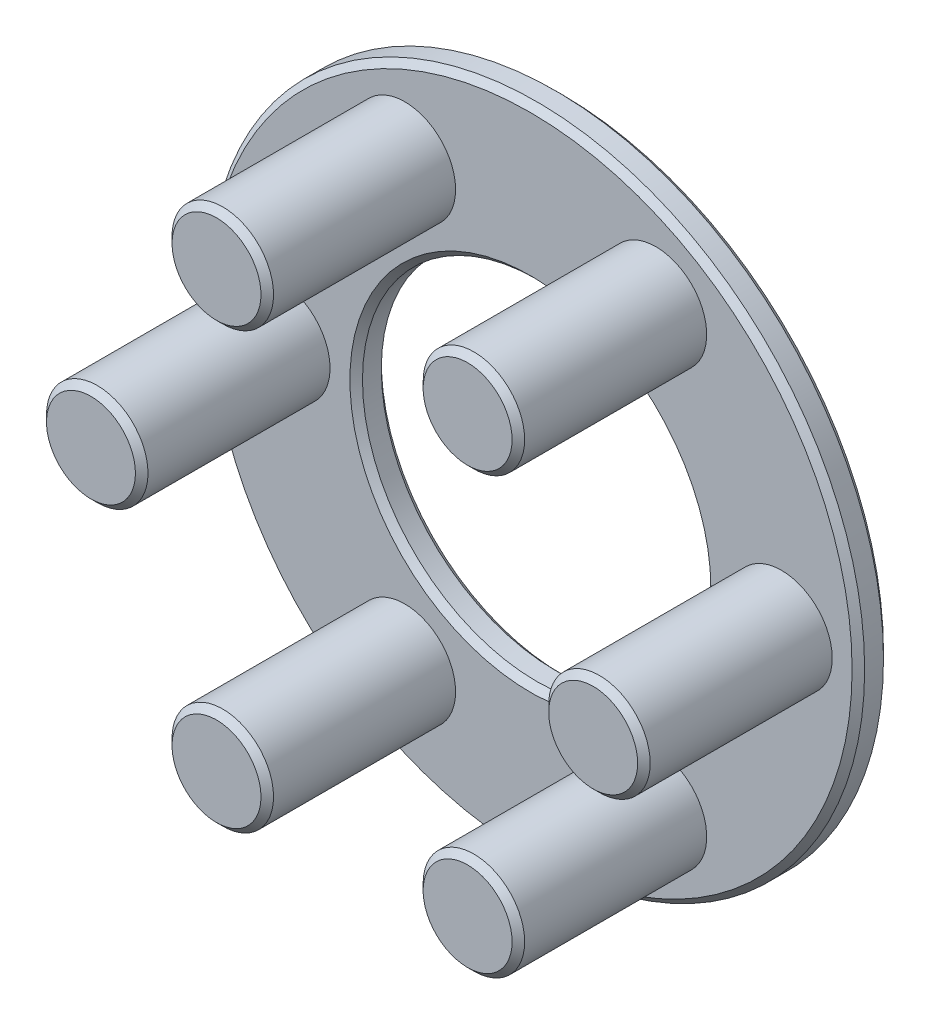
ISO-10303-21;
HEADER;
FILE_DESCRIPTION(('STEP AP214'),'2;1');
FILE_NAME('part.step','',(''),(''),'','','');
FILE_SCHEMA(('AUTOMOTIVE_DESIGN { 1 0 10303 214 1 1 1 1 }'));
ENDSEC;
DATA;
#1=APPLICATION_CONTEXT('core data for automotive mechanical design processes');
#2=APPLICATION_PROTOCOL_DEFINITION('international standard','automotive_design',2000,#1);
#3=PRODUCT_CONTEXT('',#1,'mechanical');
#4=PRODUCT('Part','Part','',(#3));
#5=PRODUCT_RELATED_PRODUCT_CATEGORY('part','',(#4));
#6=PRODUCT_DEFINITION_FORMATION('','',#4);
#7=PRODUCT_DEFINITION_CONTEXT('part definition',#1,'design');
#8=PRODUCT_DEFINITION('design','',#6,#7);
#9=PRODUCT_DEFINITION_SHAPE('','',#8);
#10=(LENGTH_UNIT() NAMED_UNIT(*) SI_UNIT(.MILLI.,.METRE.));
#11=(NAMED_UNIT(*) PLANE_ANGLE_UNIT() SI_UNIT($,.RADIAN.));
#12=(NAMED_UNIT(*) SI_UNIT($,.STERADIAN.) SOLID_ANGLE_UNIT());
#13=UNCERTAINTY_MEASURE_WITH_UNIT(LENGTH_MEASURE(1.E-05),#10,'distance_accuracy_value','');
#14=(GEOMETRIC_REPRESENTATION_CONTEXT(3) GLOBAL_UNCERTAINTY_ASSIGNED_CONTEXT((#13)) GLOBAL_UNIT_ASSIGNED_CONTEXT((#10,
#11,#12)) REPRESENTATION_CONTEXT('',''));
#15=CARTESIAN_POINT('',(0.,0.,0.));
#16=DIRECTION('',(0.,0.,1.));
#17=DIRECTION('',(1.,0.,0.));
#18=AXIS2_PLACEMENT_3D('',#15,#16,#17);
#19=CARTESIAN_POINT('',(0.,0.,1.34454816844028));
#20=DIRECTION('',(0.,0.,1.));
#21=DIRECTION('',(1.,0.,0.));
#22=AXIS2_PLACEMENT_3D('',#19,#20,#21);
#23=CYLINDRICAL_SURFACE('',#22,12.54);
#24=CARTESIAN_POINT('',(0.,0.,1.58454816844028));
#25=DIRECTION('',(0.,0.,1.));
#26=DIRECTION('',(1.,0.,0.));
#27=AXIS2_PLACEMENT_3D('',#24,#25,#26);
#28=CIRCLE('',#27,12.54);
#29=CARTESIAN_POINT('',(12.54,0.,1.58454816844028));
#30=VERTEX_POINT('',#29);
#31=EDGE_CURVE('E78',#30,#30,#28,.T.);
#32=ORIENTED_EDGE('',*,*,#31,.T.);
#33=EDGE_LOOP('',(#32));
#34=FACE_BOUND('',#33,.T.);
#35=CARTESIAN_POINT('',(0.,0.,2.30454816844028));
#36=DIRECTION('',(0.,0.,1.));
#37=DIRECTION('',(1.,0.,0.));
#38=AXIS2_PLACEMENT_3D('',#35,#36,#37);
#39=CIRCLE('',#38,12.54);
#40=CARTESIAN_POINT('',(12.54,0.,2.30454816844028));
#41=VERTEX_POINT('',#40);
#42=EDGE_CURVE('E82',#41,#41,#39,.F.);
#43=ORIENTED_EDGE('',*,*,#42,.T.);
#44=EDGE_LOOP('',(#43));
#45=FACE_BOUND('',#44,.T.);
#46=ADVANCED_FACE('F46',(#34,#45),#23,.T.);
#47=CARTESIAN_POINT('',(0.,0.,1.34454816844028));
#48=DIRECTION('',(0.,0.,1.));
#49=DIRECTION('',(1.,0.,0.));
#50=AXIS2_PLACEMENT_3D('',#47,#48,#49);
#51=PLANE('',#50);
#52=CARTESIAN_POINT('',(0.,0.,1.34454816844028));
#53=DIRECTION('',(0.,0.,1.));
#54=DIRECTION('',(1.,0.,0.));
#55=AXIS2_PLACEMENT_3D('',#52,#53,#54);
#56=CIRCLE('',#55,12.3);
#57=CARTESIAN_POINT('',(12.3,0.,1.34454816844028));
#58=VERTEX_POINT('',#57);
#59=EDGE_CURVE('E70',#58,#58,#56,.F.);
#60=ORIENTED_EDGE('',*,*,#59,.T.);
#61=EDGE_LOOP('',(#60));
#62=FACE_BOUND('',#61,.T.);
#63=CARTESIAN_POINT('',(0.,0.,1.34454816844028));
#64=DIRECTION('',(0.,0.,1.));
#65=DIRECTION('',(1.,0.,0.));
#66=AXIS2_PLACEMENT_3D('',#63,#64,#65);
#67=CIRCLE('',#66,6.9);
#68=CARTESIAN_POINT('',(6.90000000000002,0.,1.34454816844028));
#69=VERTEX_POINT('',#68);
#70=EDGE_CURVE('E74',#69,#69,#67,.T.);
#71=ORIENTED_EDGE('',*,*,#70,.T.);
#72=EDGE_LOOP('',(#71));
#73=FACE_BOUND('',#72,.T.);
#74=ADVANCED_FACE('F165',(#62,#73),#51,.F.);
#75=CARTESIAN_POINT('',(0.,0.,2.54454816844028));
#76=DIRECTION('',(0.,0.,1.));
#77=DIRECTION('',(1.,0.,0.));
#78=AXIS2_PLACEMENT_3D('',#75,#76,#77);
#79=PLANE('',#78);
#80=CARTESIAN_POINT('',(0.,0.,2.54454816844028));
#81=DIRECTION('',(0.,0.,1.));
#82=DIRECTION('',(1.,0.,0.));
#83=AXIS2_PLACEMENT_3D('',#80,#81,#82);
#84=CIRCLE('',#83,12.3);
#85=CARTESIAN_POINT('',(12.3,0.,2.54454816844028));
#86=VERTEX_POINT('',#85);
#87=EDGE_CURVE('E59',#86,#86,#84,.T.);
#88=ORIENTED_EDGE('',*,*,#87,.T.);
#89=EDGE_LOOP('',(#88));
#90=FACE_BOUND('',#89,.T.);
#91=CARTESIAN_POINT('',(0.,0.,2.54454816844028));
#92=DIRECTION('',(0.,0.,1.));
#93=DIRECTION('',(1.,0.,0.));
#94=AXIS2_PLACEMENT_3D('',#91,#92,#93);
#95=CIRCLE('',#94,6.9);
#96=CARTESIAN_POINT('',(6.90000000000001,0.,2.54454816844028));
#97=VERTEX_POINT('',#96);
#98=EDGE_CURVE('E64',#97,#97,#95,.F.);
#99=ORIENTED_EDGE('',*,*,#98,.T.);
#100=EDGE_LOOP('',(#99));
#101=FACE_BOUND('',#100,.T.);
#102=CARTESIAN_POINT('',(4.80000000000011,8.31384387633056,2.54454816844028));
#103=DIRECTION('',(0.,0.,1.));
#104=DIRECTION('',(0.50000000000001,0.866025403784433,0.));
#105=AXIS2_PLACEMENT_3D('',#102,#103,#104);
#106=CIRCLE('',#105,1.94);
#107=CARTESIAN_POINT('',(5.77000000000013,9.99393315967236,2.54454816844028));
#108=VERTEX_POINT('',#107);
#109=EDGE_CURVE('E154',#108,#108,#106,.T.);
#110=ORIENTED_EDGE('',*,*,#109,.F.);
#111=EDGE_LOOP('',(#110));
#112=FACE_BOUND('',#111,.T.);
#113=CARTESIAN_POINT('',(-4.79999999999991,8.31384387633065,2.54454816844028));
#114=DIRECTION('',(0.,0.,1.));
#115=DIRECTION('',(-0.499999999999992,0.866025403784443,0.));
#116=AXIS2_PLACEMENT_3D('',#113,#114,#115);
#117=CIRCLE('',#116,1.94);
#118=CARTESIAN_POINT('',(-5.76999999999989,9.99393315967247,2.54454816844028));
#119=VERTEX_POINT('',#118);
#120=EDGE_CURVE('E150',#119,#119,#117,.T.);
#121=ORIENTED_EDGE('',*,*,#120,.F.);
#122=EDGE_LOOP('',(#121));
#123=FACE_BOUND('',#122,.T.);
#124=CARTESIAN_POINT('',(-9.59999999999998,0.,2.54454816844028));
#125=DIRECTION('',(0.,0.,1.));
#126=DIRECTION('',(-1.,0.,0.));
#127=AXIS2_PLACEMENT_3D('',#124,#125,#126);
#128=CIRCLE('',#127,1.94);
#129=CARTESIAN_POINT('',(-11.54,0.,2.54454816844028));
#130=VERTEX_POINT('',#129);
#131=EDGE_CURVE('E146',#130,#130,#128,.T.);
#132=ORIENTED_EDGE('',*,*,#131,.F.);
#133=EDGE_LOOP('',(#132));
#134=FACE_BOUND('',#133,.T.);
#135=CARTESIAN_POINT('',(-4.80000000000002,-8.31384387633059,2.54454816844028));
#136=DIRECTION('',(0.,0.,1.));
#137=DIRECTION('',(-0.500000000000004,-0.866025403784436,0.));
#138=AXIS2_PLACEMENT_3D('',#135,#136,#137);
#139=CIRCLE('',#138,1.94);
#140=CARTESIAN_POINT('',(-5.77000000000003,-9.9939331596724,2.54454816844028));
#141=VERTEX_POINT('',#140);
#142=EDGE_CURVE('E142',#141,#141,#139,.T.);
#143=ORIENTED_EDGE('',*,*,#142,.F.);
#144=EDGE_LOOP('',(#143));
#145=FACE_BOUND('',#144,.T.);
#146=CARTESIAN_POINT('',(4.8,-8.31384387633062,2.54454816844028));
#147=DIRECTION('',(0.,0.,1.));
#148=DIRECTION('',(0.499999999999998,-0.86602540378444,0.));
#149=AXIS2_PLACEMENT_3D('',#146,#147,#148);
#150=CIRCLE('',#149,1.94);
#151=CARTESIAN_POINT('',(5.76999999999999,-9.99393315967244,2.54454816844028));
#152=VERTEX_POINT('',#151);
#153=EDGE_CURVE('E138',#152,#152,#150,.T.);
#154=ORIENTED_EDGE('',*,*,#153,.F.);
#155=EDGE_LOOP('',(#154));
#156=FACE_BOUND('',#155,.T.);
#157=CARTESIAN_POINT('',(9.60000000000002,0.,2.54454816844028));
#158=DIRECTION('',(0.,0.,1.));
#159=DIRECTION('',(1.,0.,0.));
#160=AXIS2_PLACEMENT_3D('',#157,#158,#159);
#161=CIRCLE('',#160,1.94);
#162=CARTESIAN_POINT('',(11.54,0.,2.54454816844028));
#163=VERTEX_POINT('',#162);
#164=EDGE_CURVE('E134',#163,#163,#161,.T.);
#165=ORIENTED_EDGE('',*,*,#164,.F.);
#166=EDGE_LOOP('',(#165));
#167=FACE_BOUND('',#166,.T.);
#168=ADVANCED_FACE('F161',(#90,#101,#112,#123,#134,#145,#156,#167),#79,.T.);
#169=CARTESIAN_POINT('',(0.,0.,1.34454816844028));
#170=DIRECTION('',(0.,0.,1.));
#171=DIRECTION('',(1.,0.,0.));
#172=AXIS2_PLACEMENT_3D('',#169,#170,#171);
#173=CYLINDRICAL_SURFACE('',#172,6.66);
#174=CARTESIAN_POINT('',(0.,0.,1.58454816844028));
#175=DIRECTION('',(0.,0.,1.));
#176=DIRECTION('',(1.,0.,0.));
#177=AXIS2_PLACEMENT_3D('',#174,#175,#176);
#178=CIRCLE('',#177,6.66);
#179=CARTESIAN_POINT('',(6.66000000000002,0.,1.58454816844028));
#180=VERTEX_POINT('',#179);
#181=EDGE_CURVE('E10',#180,#180,#178,.F.);
#182=ORIENTED_EDGE('',*,*,#181,.T.);
#183=EDGE_LOOP('',(#182));
#184=FACE_BOUND('',#183,.T.);
#185=CARTESIAN_POINT('',(0.,0.,2.30454816844028));
#186=DIRECTION('',(0.,0.,1.));
#187=DIRECTION('',(1.,0.,0.));
#188=AXIS2_PLACEMENT_3D('',#185,#186,#187);
#189=CIRCLE('',#188,6.66);
#190=CARTESIAN_POINT('',(6.66000000000002,0.,2.30454816844028));
#191=VERTEX_POINT('',#190);
#192=EDGE_CURVE('E54',#191,#191,#189,.T.);
#193=ORIENTED_EDGE('',*,*,#192,.T.);
#194=EDGE_LOOP('',(#193));
#195=FACE_BOUND('',#194,.T.);
#196=ADVANCED_FACE('F164',(#184,#195),#173,.F.);
#197=CARTESIAN_POINT('',(9.60000000000002,0.,9.74454816844028));
#198=DIRECTION('',(0.,0.,-1.));
#199=DIRECTION('',(-1.,0.,0.));
#200=AXIS2_PLACEMENT_3D('',#197,#198,#199);
#201=CYLINDRICAL_SURFACE('',#200,1.94);
#202=CARTESIAN_POINT('',(9.60000000000002,0.,9.50454816844028));
#203=DIRECTION('',(0.,0.,1.));
#204=DIRECTION('',(1.,0.,0.));
#205=AXIS2_PLACEMENT_3D('',#202,#203,#204);
#206=CIRCLE('',#205,1.94);
#207=CARTESIAN_POINT('',(11.54,0.,9.50454816844028));
#208=VERTEX_POINT('',#207);
#209=EDGE_CURVE('E110',#208,#208,#206,.F.);
#210=ORIENTED_EDGE('',*,*,#209,.T.);
#211=EDGE_LOOP('',(#210));
#212=FACE_BOUND('',#211,.T.);
#213=ORIENTED_EDGE('',*,*,#164,.T.);
#214=EDGE_LOOP('',(#213));
#215=FACE_BOUND('',#214,.T.);
#216=ADVANCED_FACE('F178',(#212,#215),#201,.T.);
#217=CARTESIAN_POINT('',(9.60000000000002,0.,9.74454816844028));
#218=DIRECTION('',(0.,0.,1.));
#219=DIRECTION('',(1.,0.,0.));
#220=AXIS2_PLACEMENT_3D('',#217,#218,#219);
#221=PLANE('',#220);
#222=CARTESIAN_POINT('',(9.60000000000002,0.,9.74454816844028));
#223=DIRECTION('',(0.,0.,1.));
#224=DIRECTION('',(1.,0.,0.));
#225=AXIS2_PLACEMENT_3D('',#222,#223,#224);
#226=CIRCLE('',#225,1.7);
#227=CARTESIAN_POINT('',(11.3,0.,9.74454816844028));
#228=VERTEX_POINT('',#227);
#229=EDGE_CURVE('E114',#228,#228,#226,.T.);
#230=ORIENTED_EDGE('',*,*,#229,.T.);
#231=EDGE_LOOP('',(#230));
#232=FACE_BOUND('',#231,.T.);
#233=ADVANCED_FACE('F180',(#232),#221,.T.);
#234=CARTESIAN_POINT('',(4.8,-8.31384387633062,9.74454816844028));
#235=DIRECTION('',(0.,0.,-1.));
#236=DIRECTION('',(-1.,0.,0.));
#237=AXIS2_PLACEMENT_3D('',#234,#235,#236);
#238=CYLINDRICAL_SURFACE('',#237,1.94);
#239=CARTESIAN_POINT('',(4.8,-8.31384387633062,9.50454816844028));
#240=DIRECTION('',(0.,0.,1.));
#241=DIRECTION('',(1.,0.,0.));
#242=AXIS2_PLACEMENT_3D('',#239,#240,#241);
#243=CIRCLE('',#242,1.94);
#244=CARTESIAN_POINT('',(6.74,-8.31384387633062,9.50454816844028));
#245=VERTEX_POINT('',#244);
#246=EDGE_CURVE('E118',#245,#245,#243,.F.);
#247=ORIENTED_EDGE('',*,*,#246,.T.);
#248=EDGE_LOOP('',(#247));
#249=FACE_BOUND('',#248,.T.);
#250=ORIENTED_EDGE('',*,*,#153,.T.);
#251=EDGE_LOOP('',(#250));
#252=FACE_BOUND('',#251,.T.);
#253=ADVANCED_FACE('F187',(#249,#252),#238,.T.);
#254=CARTESIAN_POINT('',(4.8,-8.31384387633062,9.74454816844028));
#255=DIRECTION('',(0.,0.,1.));
#256=DIRECTION('',(0.499999999999998,-0.86602540378444,0.));
#257=AXIS2_PLACEMENT_3D('',#254,#255,#256);
#258=PLANE('',#257);
#259=CARTESIAN_POINT('',(4.8,-8.31384387633062,9.74454816844028));
#260=DIRECTION('',(0.,0.,1.));
#261=DIRECTION('',(1.,0.,0.));
#262=AXIS2_PLACEMENT_3D('',#259,#260,#261);
#263=CIRCLE('',#262,1.7);
#264=CARTESIAN_POINT('',(6.5,-8.31384387633062,9.74454816844028));
#265=VERTEX_POINT('',#264);
#266=EDGE_CURVE('E122',#265,#265,#263,.T.);
#267=ORIENTED_EDGE('',*,*,#266,.T.);
#268=EDGE_LOOP('',(#267));
#269=FACE_BOUND('',#268,.T.);
#270=ADVANCED_FACE('F379',(#269),#258,.T.);
#271=CARTESIAN_POINT('',(-4.80000000000002,-8.31384387633059,9.74454816844028));
#272=DIRECTION('',(0.,0.,-1.));
#273=DIRECTION('',(-1.,0.,0.));
#274=AXIS2_PLACEMENT_3D('',#271,#272,#273);
#275=CYLINDRICAL_SURFACE('',#274,1.94);
#276=CARTESIAN_POINT('',(-4.80000000000002,-8.31384387633059,9.50454816844028));
#277=DIRECTION('',(0.,0.,1.));
#278=DIRECTION('',(1.,0.,0.));
#279=AXIS2_PLACEMENT_3D('',#276,#277,#278);
#280=CIRCLE('',#279,1.94);
#281=CARTESIAN_POINT('',(-2.86000000000002,-8.31384387633059,9.50454816844028));
#282=VERTEX_POINT('',#281);
#283=EDGE_CURVE('E126',#282,#282,#280,.F.);
#284=ORIENTED_EDGE('',*,*,#283,.T.);
#285=EDGE_LOOP('',(#284));
#286=FACE_BOUND('',#285,.T.);
#287=ORIENTED_EDGE('',*,*,#142,.T.);
#288=EDGE_LOOP('',(#287));
#289=FACE_BOUND('',#288,.T.);
#290=ADVANCED_FACE('F369',(#286,#289),#275,.T.);
#291=CARTESIAN_POINT('',(-4.80000000000002,-8.31384387633059,9.74454816844028));
#292=DIRECTION('',(0.,0.,1.));
#293=DIRECTION('',(-0.500000000000004,-0.866025403784436,0.));
#294=AXIS2_PLACEMENT_3D('',#291,#292,#293);
#295=PLANE('',#294);
#296=CARTESIAN_POINT('',(-4.80000000000002,-8.31384387633059,9.74454816844028));
#297=DIRECTION('',(0.,0.,1.));
#298=DIRECTION('',(1.,0.,0.));
#299=AXIS2_PLACEMENT_3D('',#296,#297,#298);
#300=CIRCLE('',#299,1.70000000000001);
#301=CARTESIAN_POINT('',(-3.10000000000002,-8.31384387633059,9.74454816844028));
#302=VERTEX_POINT('',#301);
#303=EDGE_CURVE('E130',#302,#302,#300,.T.);
#304=ORIENTED_EDGE('',*,*,#303,.T.);
#305=EDGE_LOOP('',(#304));
#306=FACE_BOUND('',#305,.T.);
#307=ADVANCED_FACE('F359',(#306),#295,.T.);
#308=CARTESIAN_POINT('',(-9.59999999999998,0.,9.74454816844028));
#309=DIRECTION('',(0.,0.,-1.));
#310=DIRECTION('',(-1.,0.,0.));
#311=AXIS2_PLACEMENT_3D('',#308,#309,#310);
#312=CYLINDRICAL_SURFACE('',#311,1.94);
#313=CARTESIAN_POINT('',(-9.59999999999998,0.,9.50454816844028));
#314=DIRECTION('',(0.,0.,1.));
#315=DIRECTION('',(1.,0.,0.));
#316=AXIS2_PLACEMENT_3D('',#313,#314,#315);
#317=CIRCLE('',#316,1.94);
#318=CARTESIAN_POINT('',(-7.65999999999998,0.,9.50454816844028));
#319=VERTEX_POINT('',#318);
#320=EDGE_CURVE('E94',#319,#319,#317,.F.);
#321=ORIENTED_EDGE('',*,*,#320,.T.);
#322=EDGE_LOOP('',(#321));
#323=FACE_BOUND('',#322,.T.);
#324=ORIENTED_EDGE('',*,*,#131,.T.);
#325=EDGE_LOOP('',(#324));
#326=FACE_BOUND('',#325,.T.);
#327=ADVANCED_FACE('F349',(#323,#326),#312,.T.);
#328=CARTESIAN_POINT('',(-9.59999999999998,0.,9.74454816844028));
#329=DIRECTION('',(0.,0.,1.));
#330=DIRECTION('',(-1.,0.,0.));
#331=AXIS2_PLACEMENT_3D('',#328,#329,#330);
#332=PLANE('',#331);
#333=CARTESIAN_POINT('',(-9.59999999999998,0.,9.74454816844028));
#334=DIRECTION('',(0.,0.,1.));
#335=DIRECTION('',(1.,0.,0.));
#336=AXIS2_PLACEMENT_3D('',#333,#334,#335);
#337=CIRCLE('',#336,1.7);
#338=CARTESIAN_POINT('',(-7.89999999999998,0.,9.74454816844028));
#339=VERTEX_POINT('',#338);
#340=EDGE_CURVE('E98',#339,#339,#337,.T.);
#341=ORIENTED_EDGE('',*,*,#340,.T.);
#342=EDGE_LOOP('',(#341));
#343=FACE_BOUND('',#342,.T.);
#344=ADVANCED_FACE('F339',(#343),#332,.T.);
#345=CARTESIAN_POINT('',(-4.79999999999991,8.31384387633065,9.74454816844028));
#346=DIRECTION('',(0.,0.,-1.));
#347=DIRECTION('',(-1.,0.,0.));
#348=AXIS2_PLACEMENT_3D('',#345,#346,#347);
#349=CYLINDRICAL_SURFACE('',#348,1.94);
#350=CARTESIAN_POINT('',(-4.79999999999991,8.31384387633065,9.50454816844028));
#351=DIRECTION('',(0.,0.,1.));
#352=DIRECTION('',(1.,0.,0.));
#353=AXIS2_PLACEMENT_3D('',#350,#351,#352);
#354=CIRCLE('',#353,1.94);
#355=CARTESIAN_POINT('',(-2.85999999999991,8.31384387633065,9.50454816844028));
#356=VERTEX_POINT('',#355);
#357=EDGE_CURVE('E86',#356,#356,#354,.F.);
#358=ORIENTED_EDGE('',*,*,#357,.T.);
#359=EDGE_LOOP('',(#358));
#360=FACE_BOUND('',#359,.T.);
#361=ORIENTED_EDGE('',*,*,#120,.T.);
#362=EDGE_LOOP('',(#361));
#363=FACE_BOUND('',#362,.T.);
#364=ADVANCED_FACE('F329',(#360,#363),#349,.T.);
#365=CARTESIAN_POINT('',(-4.79999999999991,8.31384387633065,9.74454816844028));
#366=DIRECTION('',(0.,0.,1.));
#367=DIRECTION('',(-0.499999999999992,0.866025403784443,0.));
#368=AXIS2_PLACEMENT_3D('',#365,#366,#367);
#369=PLANE('',#368);
#370=CARTESIAN_POINT('',(-4.79999999999991,8.31384387633065,9.74454816844028));
#371=DIRECTION('',(0.,0.,1.));
#372=DIRECTION('',(1.,0.,0.));
#373=AXIS2_PLACEMENT_3D('',#370,#371,#372);
#374=CIRCLE('',#373,1.70000000000001);
#375=CARTESIAN_POINT('',(-3.0999999999999,8.31384387633065,9.74454816844028));
#376=VERTEX_POINT('',#375);
#377=EDGE_CURVE('E90',#376,#376,#374,.T.);
#378=ORIENTED_EDGE('',*,*,#377,.T.);
#379=EDGE_LOOP('',(#378));
#380=FACE_BOUND('',#379,.T.);
#381=ADVANCED_FACE('F319',(#380),#369,.T.);
#382=CARTESIAN_POINT('',(4.80000000000011,8.31384387633056,9.74454816844028));
#383=DIRECTION('',(0.,0.,-1.));
#384=DIRECTION('',(-1.,0.,0.));
#385=AXIS2_PLACEMENT_3D('',#382,#383,#384);
#386=CYLINDRICAL_SURFACE('',#385,1.94);
#387=CARTESIAN_POINT('',(4.80000000000011,8.31384387633056,9.50454816844027));
#388=DIRECTION('',(0.,0.,1.));
#389=DIRECTION('',(1.,0.,0.));
#390=AXIS2_PLACEMENT_3D('',#387,#388,#389);
#391=CIRCLE('',#390,1.94);
#392=CARTESIAN_POINT('',(6.74000000000011,8.31384387633056,9.50454816844027));
#393=VERTEX_POINT('',#392);
#394=EDGE_CURVE('E102',#393,#393,#391,.F.);
#395=ORIENTED_EDGE('',*,*,#394,.T.);
#396=EDGE_LOOP('',(#395));
#397=FACE_BOUND('',#396,.T.);
#398=ORIENTED_EDGE('',*,*,#109,.T.);
#399=EDGE_LOOP('',(#398));
#400=FACE_BOUND('',#399,.T.);
#401=ADVANCED_FACE('F159',(#397,#400),#386,.T.);
#402=CARTESIAN_POINT('',(4.80000000000011,8.31384387633056,9.74454816844028));
#403=DIRECTION('',(0.,0.,1.));
#404=DIRECTION('',(0.50000000000001,0.866025403784433,0.));
#405=AXIS2_PLACEMENT_3D('',#402,#403,#404);
#406=PLANE('',#405);
#407=CARTESIAN_POINT('',(4.80000000000011,8.31384387633056,9.74454816844028));
#408=DIRECTION('',(0.,0.,1.));
#409=DIRECTION('',(1.,0.,0.));
#410=AXIS2_PLACEMENT_3D('',#407,#408,#409);
#411=CIRCLE('',#410,1.7);
#412=CARTESIAN_POINT('',(6.50000000000011,8.31384387633056,9.74454816844028));
#413=VERTEX_POINT('',#412);
#414=EDGE_CURVE('E106',#413,#413,#411,.T.);
#415=ORIENTED_EDGE('',*,*,#414,.T.);
#416=EDGE_LOOP('',(#415));
#417=FACE_BOUND('',#416,.T.);
#418=ADVANCED_FACE('F205',(#417),#406,.T.);
#419=CARTESIAN_POINT('',(-4.80000000000002,-8.31384387633059,9.74454816844028));
#420=DIRECTION('',(0.,0.,-1.));
#421=DIRECTION('',(-1.,0.,0.));
#422=AXIS2_PLACEMENT_3D('',#419,#420,#421);
#423=CONICAL_SURFACE('',#422,1.70000000000001,0.785398163397436);
#424=ORIENTED_EDGE('',*,*,#283,.F.);
#425=EDGE_LOOP('',(#424));
#426=FACE_BOUND('',#425,.T.);
#427=ORIENTED_EDGE('',*,*,#303,.F.);
#428=EDGE_LOOP('',(#427));
#429=FACE_BOUND('',#428,.T.);
#430=ADVANCED_FACE('F201',(#426,#429),#423,.T.);
#431=CARTESIAN_POINT('',(4.8,-8.31384387633062,9.74454816844028));
#432=DIRECTION('',(0.,0.,-1.));
#433=DIRECTION('',(-1.,0.,0.));
#434=AXIS2_PLACEMENT_3D('',#431,#432,#433);
#435=CONICAL_SURFACE('',#434,1.7,0.78539816339745);
#436=ORIENTED_EDGE('',*,*,#246,.F.);
#437=EDGE_LOOP('',(#436));
#438=FACE_BOUND('',#437,.T.);
#439=ORIENTED_EDGE('',*,*,#266,.F.);
#440=EDGE_LOOP('',(#439));
#441=FACE_BOUND('',#440,.T.);
#442=ADVANCED_FACE('F204',(#438,#441),#435,.T.);
#443=CARTESIAN_POINT('',(9.60000000000002,0.,9.74454816844028));
#444=DIRECTION('',(0.,0.,-1.));
#445=DIRECTION('',(-1.,0.,0.));
#446=AXIS2_PLACEMENT_3D('',#443,#444,#445);
#447=CONICAL_SURFACE('',#446,1.7,0.78539816339745);
#448=ORIENTED_EDGE('',*,*,#209,.F.);
#449=EDGE_LOOP('',(#448));
#450=FACE_BOUND('',#449,.T.);
#451=ORIENTED_EDGE('',*,*,#229,.F.);
#452=EDGE_LOOP('',(#451));
#453=FACE_BOUND('',#452,.T.);
#454=ADVANCED_FACE('F209',(#450,#453),#447,.T.);
#455=CARTESIAN_POINT('',(4.80000000000011,8.31384387633056,9.74454816844028));
#456=DIRECTION('',(0.,0.,-1.));
#457=DIRECTION('',(-1.,0.,0.));
#458=AXIS2_PLACEMENT_3D('',#455,#456,#457);
#459=CONICAL_SURFACE('',#458,1.7,0.785398163397448);
#460=ORIENTED_EDGE('',*,*,#394,.F.);
#461=EDGE_LOOP('',(#460));
#462=FACE_BOUND('',#461,.T.);
#463=ORIENTED_EDGE('',*,*,#414,.F.);
#464=EDGE_LOOP('',(#463));
#465=FACE_BOUND('',#464,.T.);
#466=ADVANCED_FACE('F213',(#462,#465),#459,.T.);
#467=CARTESIAN_POINT('',(-9.59999999999998,0.,9.74454816844028));
#468=DIRECTION('',(0.,0.,-1.));
#469=DIRECTION('',(-1.,0.,0.));
#470=AXIS2_PLACEMENT_3D('',#467,#468,#469);
#471=CONICAL_SURFACE('',#470,1.7,0.78539816339745);
#472=ORIENTED_EDGE('',*,*,#320,.F.);
#473=EDGE_LOOP('',(#472));
#474=FACE_BOUND('',#473,.T.);
#475=ORIENTED_EDGE('',*,*,#340,.F.);
#476=EDGE_LOOP('',(#475));
#477=FACE_BOUND('',#476,.T.);
#478=ADVANCED_FACE('F217',(#474,#477),#471,.T.);
#479=CARTESIAN_POINT('',(-4.79999999999991,8.31384387633065,9.74454816844028));
#480=DIRECTION('',(0.,0.,-1.));
#481=DIRECTION('',(-1.,0.,0.));
#482=AXIS2_PLACEMENT_3D('',#479,#480,#481);
#483=CONICAL_SURFACE('',#482,1.70000000000001,0.785398163397438);
#484=ORIENTED_EDGE('',*,*,#357,.F.);
#485=EDGE_LOOP('',(#484));
#486=FACE_BOUND('',#485,.T.);
#487=ORIENTED_EDGE('',*,*,#377,.F.);
#488=EDGE_LOOP('',(#487));
#489=FACE_BOUND('',#488,.T.);
#490=ADVANCED_FACE('F221',(#486,#489),#483,.T.);
#491=CARTESIAN_POINT('',(0.,0.,1.58454816844028));
#492=DIRECTION('',(0.,0.,1.));
#493=DIRECTION('',(1.,0.,0.));
#494=AXIS2_PLACEMENT_3D('',#491,#492,#493);
#495=CONICAL_SURFACE('',#494,12.54,0.785398163397454);
#496=CARTESIAN_POINT('',(12.3,0.,1.34454816844028));
#497=CARTESIAN_POINT('',(12.3025,0.,1.34704816844028));
#498=CARTESIAN_POINT('',(12.305,0.,1.34954816844028));
#499=CARTESIAN_POINT('',(12.31,0.,1.35454816844028));
#500=CARTESIAN_POINT('',(12.3125,0.,1.35704816844028));
#501=CARTESIAN_POINT('',(12.3175,0.,1.36204816844028));
#502=CARTESIAN_POINT('',(12.32,0.,1.36454816844028));
#503=CARTESIAN_POINT('',(12.325,0.,1.36954816844028));
#504=CARTESIAN_POINT('',(12.3275,0.,1.37204816844028));
#505=CARTESIAN_POINT('',(12.3325,0.,1.37704816844028));
#506=CARTESIAN_POINT('',(12.335,0.,1.37954816844028));
#507=CARTESIAN_POINT('',(12.34,0.,1.38454816844028));
#508=CARTESIAN_POINT('',(12.3425,0.,1.38704816844028));
#509=CARTESIAN_POINT('',(12.3475,0.,1.39204816844028));
#510=CARTESIAN_POINT('',(12.35,0.,1.39454816844028));
#511=CARTESIAN_POINT('',(12.355,0.,1.39954816844028));
#512=CARTESIAN_POINT('',(12.3575,0.,1.40204816844028));
#513=CARTESIAN_POINT('',(12.3625,0.,1.40704816844028));
#514=CARTESIAN_POINT('',(12.365,0.,1.40954816844028));
#515=CARTESIAN_POINT('',(12.37,0.,1.41454816844028));
#516=CARTESIAN_POINT('',(12.3725,0.,1.41704816844028));
#517=CARTESIAN_POINT('',(12.3775,0.,1.42204816844028));
#518=CARTESIAN_POINT('',(12.38,0.,1.42454816844028));
#519=CARTESIAN_POINT('',(12.385,0.,1.42954816844028));
#520=CARTESIAN_POINT('',(12.3875,0.,1.43204816844028));
#521=CARTESIAN_POINT('',(12.3925,0.,1.43704816844028));
#522=CARTESIAN_POINT('',(12.395,0.,1.43954816844028));
#523=CARTESIAN_POINT('',(12.4,0.,1.44454816844028));
#524=CARTESIAN_POINT('',(12.4025,0.,1.44704816844028));
#525=CARTESIAN_POINT('',(12.4075,0.,1.45204816844028));
#526=CARTESIAN_POINT('',(12.41,0.,1.45454816844028));
#527=CARTESIAN_POINT('',(12.415,0.,1.45954816844028));
#528=CARTESIAN_POINT('',(12.4175,0.,1.46204816844028));
#529=CARTESIAN_POINT('',(12.4225,0.,1.46704816844028));
#530=CARTESIAN_POINT('',(12.425,0.,1.46954816844028));
#531=CARTESIAN_POINT('',(12.43,0.,1.47454816844028));
#532=CARTESIAN_POINT('',(12.4325,0.,1.47704816844028));
#533=CARTESIAN_POINT('',(12.4375,0.,1.48204816844028));
#534=CARTESIAN_POINT('',(12.44,0.,1.48454816844028));
#535=CARTESIAN_POINT('',(12.445,0.,1.48954816844028));
#536=CARTESIAN_POINT('',(12.4475,0.,1.49204816844028));
#537=CARTESIAN_POINT('',(12.4525,0.,1.49704816844028));
#538=CARTESIAN_POINT('',(12.455,0.,1.49954816844028));
#539=CARTESIAN_POINT('',(12.46,0.,1.50454816844028));
#540=CARTESIAN_POINT('',(12.4625,0.,1.50704816844028));
#541=CARTESIAN_POINT('',(12.4675,0.,1.51204816844028));
#542=CARTESIAN_POINT('',(12.47,0.,1.51454816844028));
#543=CARTESIAN_POINT('',(12.475,0.,1.51954816844028));
#544=CARTESIAN_POINT('',(12.4775,0.,1.52204816844028));
#545=CARTESIAN_POINT('',(12.4825,0.,1.52704816844028));
#546=CARTESIAN_POINT('',(12.485,0.,1.52954816844028));
#547=CARTESIAN_POINT('',(12.49,0.,1.53454816844028));
#548=CARTESIAN_POINT('',(12.4925,0.,1.53704816844028));
#549=CARTESIAN_POINT('',(12.4975,0.,1.54204816844028));
#550=CARTESIAN_POINT('',(12.5,0.,1.54454816844028));
#551=CARTESIAN_POINT('',(12.505,0.,1.54954816844028));
#552=CARTESIAN_POINT('',(12.5075,0.,1.55204816844028));
#553=CARTESIAN_POINT('',(12.5125,0.,1.55704816844028));
#554=CARTESIAN_POINT('',(12.515,0.,1.55954816844028));
#555=CARTESIAN_POINT('',(12.52,0.,1.56454816844028));
#556=CARTESIAN_POINT('',(12.5225,0.,1.56704816844028));
#557=CARTESIAN_POINT('',(12.5275,0.,1.57204816844028));
#558=CARTESIAN_POINT('',(12.53,0.,1.57454816844028));
#559=CARTESIAN_POINT('',(12.535,0.,1.57954816844028));
#560=CARTESIAN_POINT('',(12.5375,0.,1.58204816844028));
#561=CARTESIAN_POINT('',(12.54,0.,1.58454816844028));
#562=B_SPLINE_CURVE_WITH_KNOTS('',3,(#496,#497,#498,#499,#500,#501,#502,#503,#504,#505,#506,
#507,#508,#509,#510,#511,#512,#513,#514,#515,#516,#517,#518,#519,#520,#521,#522,#523,#524,#525,
#526,#527,#528,#529,#530,#531,#532,#533,#534,#535,#536,#537,#538,#539,#540,#541,#542,#543,#544,
#545,#546,#547,#548,#549,#550,#551,#552,#553,#554,#555,#556,#557,#558,#559,#560,#561),
.UNSPECIFIED.,.F.,.F.,(4,2,2,2,2,2,2,2,2,2,2,2,2,2,2,2,2,2,2,2,2,2,2,2,2,2,2,2,2,2,2,2,4),(0.,
0.0106066017177987,0.0212132034355974,0.0318198051533961,0.0424264068711948,0.0530330085889923,
0.063639610306791,0.0742462120245897,0.0848528137423884,0.0954594154601871,0.106066017177985,
0.116672618895783,0.127279220613582,0.137885822331381,0.14849242404918,0.159099025766977,
0.169705627484776,0.180312229202574,0.190918830920373,0.201525432638172,0.212132034355969,
0.222738636073768,0.233345237791566,0.243951839509365,0.254558441227164,0.265165042944961,
0.27577164466276,0.286378246380559,0.296984848098358,0.307591449816156,0.318198051533954,
0.328804653251752,0.339411254969551),.UNSPECIFIED.);
#563=EDGE_CURVE('BSEAM225',#58,#30,#562,.T.);
#564=ORIENTED_EDGE('',*,*,#59,.F.);
#565=ORIENTED_EDGE('',*,*,#31,.F.);
#566=ORIENTED_EDGE('',*,*,#563,.T.);
#567=ORIENTED_EDGE('',*,*,#563,.F.);
#568=EDGE_LOOP('',(#564,#566,#565,#567));
#569=FACE_BOUND('',#568,.T.);
#570=ADVANCED_FACE('F225',(#569),#495,.T.);
#571=CARTESIAN_POINT('',(0.,0.,2.54454816844028));
#572=DIRECTION('',(0.,0.,-1.));
#573=DIRECTION('',(-1.,0.,0.));
#574=AXIS2_PLACEMENT_3D('',#571,#572,#573);
#575=CONICAL_SURFACE('',#574,12.3,0.785398163397448);
#576=ORIENTED_EDGE('',*,*,#42,.F.);
#577=EDGE_LOOP('',(#576));
#578=FACE_BOUND('',#577,.T.);
#579=ORIENTED_EDGE('',*,*,#87,.F.);
#580=EDGE_LOOP('',(#579));
#581=FACE_BOUND('',#580,.T.);
#582=ADVANCED_FACE('F229',(#578,#581),#575,.T.);
#583=CARTESIAN_POINT('',(0.,0.,1.34454816844028));
#584=DIRECTION('',(0.,0.,-1.));
#585=DIRECTION('',(-1.,0.,0.));
#586=AXIS2_PLACEMENT_3D('',#583,#584,#585);
#587=CONICAL_SURFACE('',#586,6.9,0.785398163397445);
#588=ORIENTED_EDGE('',*,*,#181,.F.);
#589=EDGE_LOOP('',(#588));
#590=FACE_BOUND('',#589,.T.);
#591=ORIENTED_EDGE('',*,*,#70,.F.);
#592=EDGE_LOOP('',(#591));
#593=FACE_BOUND('',#592,.T.);
#594=ADVANCED_FACE('F232',(#590,#593),#587,.F.);
#595=CARTESIAN_POINT('',(0.,0.,2.30454816844028));
#596=DIRECTION('',(0.,0.,1.));
#597=DIRECTION('',(1.,0.,0.));
#598=AXIS2_PLACEMENT_3D('',#595,#596,#597);
#599=CONICAL_SURFACE('',#598,6.66,0.785398163397445);
#600=ORIENTED_EDGE('',*,*,#98,.F.);
#601=EDGE_LOOP('',(#600));
#602=FACE_BOUND('',#601,.T.);
#603=ORIENTED_EDGE('',*,*,#192,.F.);
#604=EDGE_LOOP('',(#603));
#605=FACE_BOUND('',#604,.T.);
#606=ADVANCED_FACE('F48',(#602,#605),#599,.F.);
#607=CLOSED_SHELL('',(#46,#74,#168,#196,#216,#233,#253,#270,#290,#307,#327,#344,#364,#381,#401,
#418,#430,#442,#454,#466,#478,#490,#570,#582,#594,#606));
#608=MANIFOLD_SOLID_BREP('B2',#607);
#609=ADVANCED_BREP_SHAPE_REPRESENTATION('',(#18,#608),#14);
#610=SHAPE_DEFINITION_REPRESENTATION(#9,#609);
ENDSEC;
END-ISO-10303-21;
